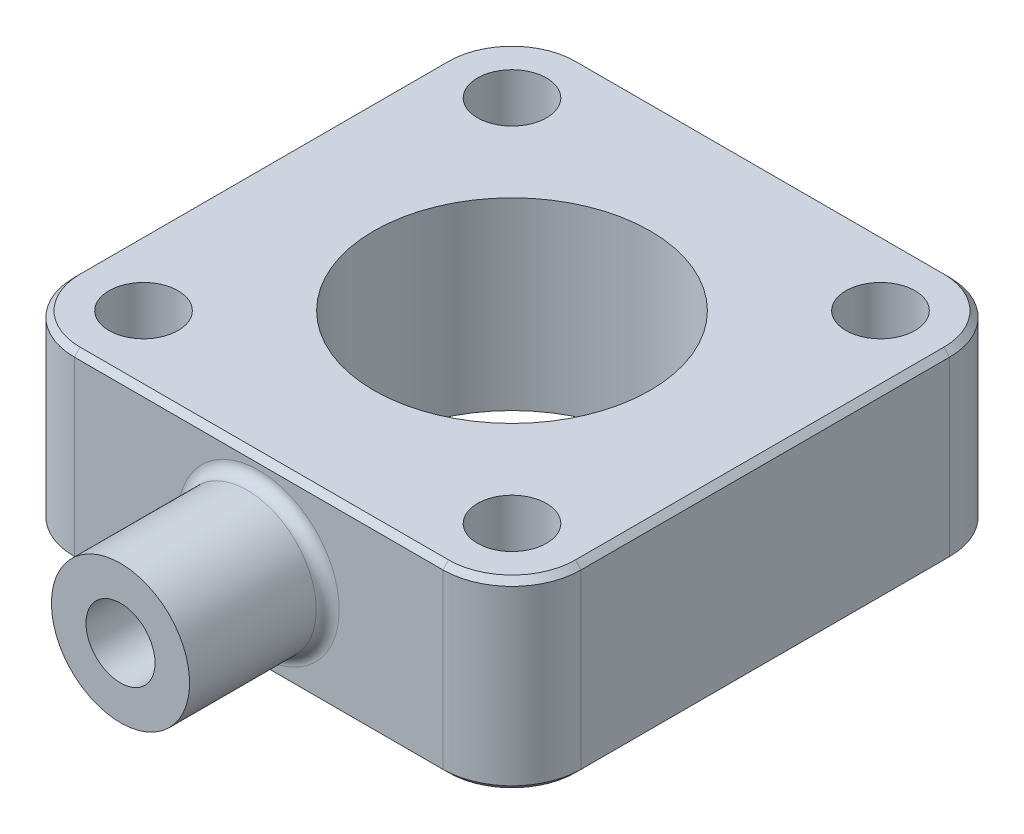
ISO-10303-21;
HEADER;
FILE_DESCRIPTION(('STEP AP214'),'2;1');
FILE_NAME('part.step','',(''),(''),'','','');
FILE_SCHEMA(('AUTOMOTIVE_DESIGN { 1 0 10303 214 1 1 1 1 }'));
ENDSEC;
DATA;
#1=APPLICATION_CONTEXT('core data for automotive mechanical design processes');
#2=APPLICATION_PROTOCOL_DEFINITION('international standard','automotive_design',2000,#1);
#3=PRODUCT_CONTEXT('',#1,'mechanical');
#4=PRODUCT('Part','Part','',(#3));
#5=PRODUCT_RELATED_PRODUCT_CATEGORY('part','',(#4));
#6=PRODUCT_DEFINITION_FORMATION('','',#4);
#7=PRODUCT_DEFINITION_CONTEXT('part definition',#1,'design');
#8=PRODUCT_DEFINITION('design','',#6,#7);
#9=PRODUCT_DEFINITION_SHAPE('','',#8);
#10=(LENGTH_UNIT() NAMED_UNIT(*) SI_UNIT(.MILLI.,.METRE.));
#11=(NAMED_UNIT(*) PLANE_ANGLE_UNIT() SI_UNIT($,.RADIAN.));
#12=(NAMED_UNIT(*) SI_UNIT($,.STERADIAN.) SOLID_ANGLE_UNIT());
#13=UNCERTAINTY_MEASURE_WITH_UNIT(LENGTH_MEASURE(1.E-05),#10,'distance_accuracy_value','');
#14=(GEOMETRIC_REPRESENTATION_CONTEXT(3) GLOBAL_UNCERTAINTY_ASSIGNED_CONTEXT((#13)) GLOBAL_UNIT_ASSIGNED_CONTEXT((#10,
#11,#12)) REPRESENTATION_CONTEXT('',''));
#15=CARTESIAN_POINT('',(0.,0.,0.));
#16=DIRECTION('',(0.,0.,1.));
#17=DIRECTION('',(1.,0.,0.));
#18=AXIS2_PLACEMENT_3D('',#15,#16,#17);
#19=CARTESIAN_POINT('',(8.,4.,8.));
#20=DIRECTION('',(0.,1.,0.));
#21=DIRECTION('',(0.,0.,1.));
#22=AXIS2_PLACEMENT_3D('',#19,#20,#21);
#23=PLANE('',#22);
#24=CARTESIAN_POINT('',(8.,4.,-8.));
#25=DIRECTION('',(0.,1.,0.));
#26=DIRECTION('',(0.,0.,1.));
#27=AXIS2_PLACEMENT_3D('',#24,#25,#26);
#28=CIRCLE('',#27,2.75);
#29=CARTESIAN_POINT('',(10.75,4.,-7.99999999999998));
#30=VERTEX_POINT('',#29);
#31=CARTESIAN_POINT('',(7.99999999999998,4.,-10.75));
#32=VERTEX_POINT('',#31);
#33=EDGE_CURVE('E69',#30,#32,#28,.T.);
#34=ORIENTED_EDGE('',*,*,#33,.T.);
#35=DIRECTION('',(-1.,0.,0.));
#36=VECTOR('',#35,1.);
#37=CARTESIAN_POINT('',(-7.99999999999998,4.,-10.75));
#38=LINE('',#37,#36);
#39=CARTESIAN_POINT('',(-7.99999999999998,4.,-10.75));
#40=VERTEX_POINT('',#39);
#41=EDGE_CURVE('E229',#32,#40,#38,.T.);
#42=ORIENTED_EDGE('',*,*,#41,.T.);
#43=CARTESIAN_POINT('',(-8.,4.,-7.99999999999999));
#44=DIRECTION('',(0.,1.,0.));
#45=DIRECTION('',(0.,0.,1.));
#46=AXIS2_PLACEMENT_3D('',#43,#44,#45);
#47=CIRCLE('',#46,2.75);
#48=CARTESIAN_POINT('',(-10.75,4.,-7.99999999999997));
#49=VERTEX_POINT('',#48);
#50=EDGE_CURVE('E195',#40,#49,#47,.T.);
#51=ORIENTED_EDGE('',*,*,#50,.T.);
#52=DIRECTION('',(0.,0.,1.));
#53=VECTOR('',#52,1.);
#54=CARTESIAN_POINT('',(-10.75,4.,7.99999999999998));
#55=LINE('',#54,#53);
#56=CARTESIAN_POINT('',(-10.75,4.,7.99999999999998));
#57=VERTEX_POINT('',#56);
#58=EDGE_CURVE('E503',#49,#57,#55,.T.);
#59=ORIENTED_EDGE('',*,*,#58,.T.);
#60=CARTESIAN_POINT('',(-8.,4.,8.));
#61=DIRECTION('',(0.,1.,0.));
#62=DIRECTION('',(0.,0.,1.));
#63=AXIS2_PLACEMENT_3D('',#60,#61,#62);
#64=CIRCLE('',#63,2.75);
#65=CARTESIAN_POINT('',(-7.99999999999998,4.,10.75));
#66=VERTEX_POINT('',#65);
#67=EDGE_CURVE('E497',#57,#66,#64,.T.);
#68=ORIENTED_EDGE('',*,*,#67,.T.);
#69=DIRECTION('',(1.,0.,0.));
#70=VECTOR('',#69,1.);
#71=CARTESIAN_POINT('',(7.99999999999998,4.,10.75));
#72=LINE('',#71,#70);
#73=CARTESIAN_POINT('',(7.99999999999998,4.,10.75));
#74=VERTEX_POINT('',#73);
#75=EDGE_CURVE('E462',#66,#74,#72,.T.);
#76=ORIENTED_EDGE('',*,*,#75,.T.);
#77=CARTESIAN_POINT('',(8.,4.,8.));
#78=DIRECTION('',(0.,1.,0.));
#79=DIRECTION('',(0.,0.,1.));
#80=AXIS2_PLACEMENT_3D('',#77,#78,#79);
#81=CIRCLE('',#80,2.75);
#82=CARTESIAN_POINT('',(10.75,4.,7.99999999999997));
#83=VERTEX_POINT('',#82);
#84=EDGE_CURVE('E494',#74,#83,#81,.T.);
#85=ORIENTED_EDGE('',*,*,#84,.T.);
#86=DIRECTION('',(0.,0.,-1.));
#87=VECTOR('',#86,1.);
#88=CARTESIAN_POINT('',(10.75,4.,-7.99999999999998));
#89=LINE('',#88,#87);
#90=EDGE_CURVE('E500',#83,#30,#89,.T.);
#91=ORIENTED_EDGE('',*,*,#90,.T.);
#92=EDGE_LOOP('',(#34,#42,#51,#59,#68,#76,#85,#91));
#93=FACE_BOUND('',#92,.T.);
#94=CARTESIAN_POINT('',(-8.,4.,8.));
#95=DIRECTION('',(0.,1.,0.));
#96=DIRECTION('',(0.,0.,1.));
#97=AXIS2_PLACEMENT_3D('',#94,#95,#96);
#98=CIRCLE('',#97,1.5);
#99=CARTESIAN_POINT('',(-8.,4.,9.5));
#100=VERTEX_POINT('',#99);
#101=EDGE_CURVE('E602',#100,#100,#98,.T.);
#102=ORIENTED_EDGE('',*,*,#101,.F.);
#103=EDGE_LOOP('',(#102));
#104=FACE_BOUND('',#103,.T.);
#105=CARTESIAN_POINT('',(8.,4.,-8.));
#106=DIRECTION('',(0.,1.,0.));
#107=DIRECTION('',(0.,0.,1.));
#108=AXIS2_PLACEMENT_3D('',#105,#106,#107);
#109=CIRCLE('',#108,1.5);
#110=CARTESIAN_POINT('',(8.,4.,-6.5));
#111=VERTEX_POINT('',#110);
#112=EDGE_CURVE('E586',#111,#111,#109,.T.);
#113=ORIENTED_EDGE('',*,*,#112,.F.);
#114=EDGE_LOOP('',(#113));
#115=FACE_BOUND('',#114,.T.);
#116=CARTESIAN_POINT('',(-8.,4.,-7.99999999999999));
#117=DIRECTION('',(0.,1.,0.));
#118=DIRECTION('',(0.,0.,1.));
#119=AXIS2_PLACEMENT_3D('',#116,#117,#118);
#120=CIRCLE('',#119,1.5);
#121=CARTESIAN_POINT('',(-8.,4.,-6.49999999999999));
#122=VERTEX_POINT('',#121);
#123=EDGE_CURVE('E581',#122,#122,#120,.T.);
#124=ORIENTED_EDGE('',*,*,#123,.F.);
#125=EDGE_LOOP('',(#124));
#126=FACE_BOUND('',#125,.T.);
#127=CARTESIAN_POINT('',(8.,4.,8.));
#128=DIRECTION('',(0.,1.,0.));
#129=DIRECTION('',(0.,0.,1.));
#130=AXIS2_PLACEMENT_3D('',#127,#128,#129);
#131=CIRCLE('',#130,1.5);
#132=CARTESIAN_POINT('',(8.,4.,9.5));
#133=VERTEX_POINT('',#132);
#134=EDGE_CURVE('E594',#133,#133,#131,.T.);
#135=ORIENTED_EDGE('',*,*,#134,.F.);
#136=EDGE_LOOP('',(#135));
#137=FACE_BOUND('',#136,.T.);
#138=CARTESIAN_POINT('',(0.,4.,0.));
#139=DIRECTION('',(0.,1.,0.));
#140=DIRECTION('',(0.,0.,1.));
#141=AXIS2_PLACEMENT_3D('',#138,#139,#140);
#142=CIRCLE('',#141,6.);
#143=CARTESIAN_POINT('',(0.,4.,6.));
#144=VERTEX_POINT('',#143);
#145=EDGE_CURVE('E610',#144,#144,#142,.T.);
#146=ORIENTED_EDGE('',*,*,#145,.F.);
#147=EDGE_LOOP('',(#146));
#148=FACE_BOUND('',#147,.T.);
#149=ADVANCED_FACE('F45',(#93,#104,#115,#126,#137,#148),#23,.T.);
#150=CARTESIAN_POINT('',(8.,-4.,8.));
#151=DIRECTION('',(0.,1.,0.));
#152=DIRECTION('',(0.,0.,1.));
#153=AXIS2_PLACEMENT_3D('',#150,#151,#152);
#154=PLANE('',#153);
#155=CARTESIAN_POINT('',(-8.,-4.,-7.99999999999999));
#156=DIRECTION('',(0.,1.,0.));
#157=DIRECTION('',(0.,0.,1.));
#158=AXIS2_PLACEMENT_3D('',#155,#156,#157);
#159=CIRCLE('',#158,2.75);
#160=CARTESIAN_POINT('',(-10.75,-4.,-7.99999999999997));
#161=VERTEX_POINT('',#160);
#162=CARTESIAN_POINT('',(-7.99999999999998,-4.,-10.75));
#163=VERTEX_POINT('',#162);
#164=EDGE_CURVE('E542',#161,#163,#159,.F.);
#165=ORIENTED_EDGE('',*,*,#164,.T.);
#166=DIRECTION('',(1.,0.,0.));
#167=VECTOR('',#166,1.);
#168=CARTESIAN_POINT('',(8.,-4.,-10.75));
#169=LINE('',#168,#167);
#170=CARTESIAN_POINT('',(7.99999999999998,-4.,-10.75));
#171=VERTEX_POINT('',#170);
#172=EDGE_CURVE('E174',#163,#171,#169,.T.);
#173=ORIENTED_EDGE('',*,*,#172,.T.);
#174=CARTESIAN_POINT('',(8.,-4.,-8.));
#175=DIRECTION('',(0.,1.,0.));
#176=DIRECTION('',(0.,0.,1.));
#177=AXIS2_PLACEMENT_3D('',#174,#175,#176);
#178=CIRCLE('',#177,2.75);
#179=CARTESIAN_POINT('',(10.75,-4.,-7.99999999999998));
#180=VERTEX_POINT('',#179);
#181=EDGE_CURVE('E545',#171,#180,#178,.F.);
#182=ORIENTED_EDGE('',*,*,#181,.T.);
#183=DIRECTION('',(0.,0.,1.));
#184=VECTOR('',#183,1.);
#185=CARTESIAN_POINT('',(10.75,-4.,8.));
#186=LINE('',#185,#184);
#187=CARTESIAN_POINT('',(10.75,-4.,7.99999999999997));
#188=VERTEX_POINT('',#187);
#189=EDGE_CURVE('E551',#180,#188,#186,.T.);
#190=ORIENTED_EDGE('',*,*,#189,.T.);
#191=CARTESIAN_POINT('',(8.,-4.,8.));
#192=DIRECTION('',(0.,1.,0.));
#193=DIRECTION('',(0.,0.,1.));
#194=AXIS2_PLACEMENT_3D('',#191,#192,#193);
#195=CIRCLE('',#194,2.75);
#196=CARTESIAN_POINT('',(7.99999999999998,-4.,10.75));
#197=VERTEX_POINT('',#196);
#198=EDGE_CURVE('E557',#188,#197,#195,.F.);
#199=ORIENTED_EDGE('',*,*,#198,.T.);
#200=DIRECTION('',(-1.,0.,0.));
#201=VECTOR('',#200,1.);
#202=CARTESIAN_POINT('',(8.,-4.,10.75));
#203=LINE('',#202,#201);
#204=CARTESIAN_POINT('',(-7.99999999999998,-4.,10.75));
#205=VERTEX_POINT('',#204);
#206=EDGE_CURVE('E560',#197,#205,#203,.T.);
#207=ORIENTED_EDGE('',*,*,#206,.T.);
#208=CARTESIAN_POINT('',(-8.,-4.,8.));
#209=DIRECTION('',(0.,1.,0.));
#210=DIRECTION('',(0.,0.,1.));
#211=AXIS2_PLACEMENT_3D('',#208,#209,#210);
#212=CIRCLE('',#211,2.75);
#213=CARTESIAN_POINT('',(-10.75,-4.,7.99999999999998));
#214=VERTEX_POINT('',#213);
#215=EDGE_CURVE('E554',#205,#214,#212,.F.);
#216=ORIENTED_EDGE('',*,*,#215,.T.);
#217=DIRECTION('',(0.,0.,-1.));
#218=VECTOR('',#217,1.);
#219=CARTESIAN_POINT('',(-10.75,-4.,8.));
#220=LINE('',#219,#218);
#221=EDGE_CURVE('E548',#214,#161,#220,.T.);
#222=ORIENTED_EDGE('',*,*,#221,.T.);
#223=EDGE_LOOP('',(#165,#173,#182,#190,#199,#207,#216,#222));
#224=FACE_BOUND('',#223,.T.);
#225=CARTESIAN_POINT('',(-8.,-4.,-7.99999999999999));
#226=DIRECTION('',(0.,1.,0.));
#227=DIRECTION('',(0.,0.,1.));
#228=AXIS2_PLACEMENT_3D('',#225,#226,#227);
#229=CIRCLE('',#228,1.5);
#230=CARTESIAN_POINT('',(-8.,-4.,-6.49999999999999));
#231=VERTEX_POINT('',#230);
#232=EDGE_CURVE('E582',#231,#231,#229,.T.);
#233=ORIENTED_EDGE('',*,*,#232,.T.);
#234=EDGE_LOOP('',(#233));
#235=FACE_BOUND('',#234,.T.);
#236=CARTESIAN_POINT('',(8.,-4.,-8.));
#237=DIRECTION('',(0.,1.,0.));
#238=DIRECTION('',(0.,0.,1.));
#239=AXIS2_PLACEMENT_3D('',#236,#237,#238);
#240=CIRCLE('',#239,1.5);
#241=CARTESIAN_POINT('',(8.,-4.,-6.5));
#242=VERTEX_POINT('',#241);
#243=EDGE_CURVE('E590',#242,#242,#240,.T.);
#244=ORIENTED_EDGE('',*,*,#243,.T.);
#245=EDGE_LOOP('',(#244));
#246=FACE_BOUND('',#245,.T.);
#247=CARTESIAN_POINT('',(8.,-4.,8.));
#248=DIRECTION('',(0.,1.,0.));
#249=DIRECTION('',(0.,0.,1.));
#250=AXIS2_PLACEMENT_3D('',#247,#248,#249);
#251=CIRCLE('',#250,1.5);
#252=CARTESIAN_POINT('',(8.,-4.,9.5));
#253=VERTEX_POINT('',#252);
#254=EDGE_CURVE('E598',#253,#253,#251,.T.);
#255=ORIENTED_EDGE('',*,*,#254,.T.);
#256=EDGE_LOOP('',(#255));
#257=FACE_BOUND('',#256,.T.);
#258=CARTESIAN_POINT('',(-8.,-4.,8.));
#259=DIRECTION('',(0.,1.,0.));
#260=DIRECTION('',(0.,0.,1.));
#261=AXIS2_PLACEMENT_3D('',#258,#259,#260);
#262=CIRCLE('',#261,1.5);
#263=CARTESIAN_POINT('',(-8.,-4.,9.5));
#264=VERTEX_POINT('',#263);
#265=EDGE_CURVE('E606',#264,#264,#262,.T.);
#266=ORIENTED_EDGE('',*,*,#265,.T.);
#267=EDGE_LOOP('',(#266));
#268=FACE_BOUND('',#267,.T.);
#269=CARTESIAN_POINT('',(0.,-4.,0.));
#270=DIRECTION('',(0.,1.,0.));
#271=DIRECTION('',(0.,0.,1.));
#272=AXIS2_PLACEMENT_3D('',#269,#270,#271);
#273=CIRCLE('',#272,6.);
#274=CARTESIAN_POINT('',(0.,-4.,6.));
#275=VERTEX_POINT('',#274);
#276=EDGE_CURVE('E614',#275,#275,#273,.T.);
#277=ORIENTED_EDGE('',*,*,#276,.T.);
#278=EDGE_LOOP('',(#277));
#279=FACE_BOUND('',#278,.T.);
#280=ADVANCED_FACE('F312',(#224,#235,#246,#257,#268,#279),#154,.F.);
#281=CARTESIAN_POINT('',(8.,4.,8.));
#282=DIRECTION('',(0.,-1.,0.));
#283=DIRECTION('',(0.,0.,-1.));
#284=AXIS2_PLACEMENT_3D('',#281,#282,#283);
#285=CYLINDRICAL_SURFACE('',#284,3.);
#286=DIRECTION('',(0.,-1.,0.));
#287=VECTOR('',#286,1.);
#288=CARTESIAN_POINT('',(7.99999999999998,4.,11.));
#289=LINE('',#288,#287);
#290=CARTESIAN_POINT('',(7.99999999999998,3.75,11.));
#291=VERTEX_POINT('',#290);
#292=CARTESIAN_POINT('',(7.99999999999998,-3.75,11.));
#293=VERTEX_POINT('',#292);
#294=EDGE_CURVE('E578',#291,#293,#289,.T.);
#295=ORIENTED_EDGE('',*,*,#294,.T.);
#296=CARTESIAN_POINT('',(8.,-3.75,8.));
#297=DIRECTION('',(0.,1.,0.));
#298=DIRECTION('',(0.,0.,1.));
#299=AXIS2_PLACEMENT_3D('',#296,#297,#298);
#300=CIRCLE('',#299,3.);
#301=CARTESIAN_POINT('',(11.,-3.75,7.99999999999997));
#302=VERTEX_POINT('',#301);
#303=EDGE_CURVE('E484',#293,#302,#300,.T.);
#304=ORIENTED_EDGE('',*,*,#303,.T.);
#305=DIRECTION('',(0.,-1.,0.));
#306=VECTOR('',#305,1.);
#307=CARTESIAN_POINT('',(11.,4.,7.99999999999997));
#308=LINE('',#307,#306);
#309=CARTESIAN_POINT('',(11.,3.75,7.99999999999997));
#310=VERTEX_POINT('',#309);
#311=EDGE_CURVE('E192',#310,#302,#308,.T.);
#312=ORIENTED_EDGE('',*,*,#311,.F.);
#313=CARTESIAN_POINT('',(8.,3.75,8.));
#314=DIRECTION('',(0.,1.,0.));
#315=DIRECTION('',(0.,0.,1.));
#316=AXIS2_PLACEMENT_3D('',#313,#314,#315);
#317=CIRCLE('',#316,3.);
#318=EDGE_CURVE('E476',#310,#291,#317,.F.);
#319=ORIENTED_EDGE('',*,*,#318,.T.);
#320=EDGE_LOOP('',(#295,#304,#312,#319));
#321=FACE_BOUND('',#320,.T.);
#322=ADVANCED_FACE('F317',(#321),#285,.T.);
#323=CARTESIAN_POINT('',(11.,4.,7.99999999999997));
#324=DIRECTION('',(-1.,0.,0.));
#325=DIRECTION('',(0.,0.,1.));
#326=AXIS2_PLACEMENT_3D('',#323,#324,#325);
#327=PLANE('',#326);
#328=ORIENTED_EDGE('',*,*,#311,.T.);
#329=DIRECTION('',(0.,0.,-1.));
#330=VECTOR('',#329,1.);
#331=CARTESIAN_POINT('',(11.,-3.75,7.99999999999997));
#332=LINE('',#331,#330);
#333=CARTESIAN_POINT('',(11.,-3.75,-7.99999999999998));
#334=VERTEX_POINT('',#333);
#335=EDGE_CURVE('E472',#302,#334,#332,.T.);
#336=ORIENTED_EDGE('',*,*,#335,.T.);
#337=DIRECTION('',(0.,-1.,0.));
#338=VECTOR('',#337,1.);
#339=CARTESIAN_POINT('',(11.,4.,-7.99999999999998));
#340=LINE('',#339,#338);
#341=CARTESIAN_POINT('',(11.,3.75,-7.99999999999998));
#342=VERTEX_POINT('',#341);
#343=EDGE_CURVE('E525',#342,#334,#340,.T.);
#344=ORIENTED_EDGE('',*,*,#343,.F.);
#345=DIRECTION('',(0.,0.,1.));
#346=VECTOR('',#345,1.);
#347=CARTESIAN_POINT('',(11.,3.75,7.99999999999997));
#348=LINE('',#347,#346);
#349=EDGE_CURVE('E478',#342,#310,#348,.T.);
#350=ORIENTED_EDGE('',*,*,#349,.T.);
#351=EDGE_LOOP('',(#328,#336,#344,#350));
#352=FACE_BOUND('',#351,.T.);
#353=ADVANCED_FACE('F343',(#352),#327,.F.);
#354=CARTESIAN_POINT('',(8.,4.,-8.));
#355=DIRECTION('',(0.,-1.,0.));
#356=DIRECTION('',(0.,0.,-1.));
#357=AXIS2_PLACEMENT_3D('',#354,#355,#356);
#358=CYLINDRICAL_SURFACE('',#357,3.);
#359=ORIENTED_EDGE('',*,*,#343,.T.);
#360=CARTESIAN_POINT('',(8.,-3.75,-8.));
#361=DIRECTION('',(0.,1.,0.));
#362=DIRECTION('',(0.,0.,1.));
#363=AXIS2_PLACEMENT_3D('',#360,#361,#362);
#364=CIRCLE('',#363,3.);
#365=CARTESIAN_POINT('',(7.99999999999998,-3.75,-11.));
#366=VERTEX_POINT('',#365);
#367=EDGE_CURVE('E510',#334,#366,#364,.T.);
#368=ORIENTED_EDGE('',*,*,#367,.T.);
#369=DIRECTION('',(0.,-1.,0.));
#370=VECTOR('',#369,1.);
#371=CARTESIAN_POINT('',(7.99999999999998,4.,-11.));
#372=LINE('',#371,#370);
#373=CARTESIAN_POINT('',(7.99999999999998,3.75,-11.));
#374=VERTEX_POINT('',#373);
#375=EDGE_CURVE('E186',#374,#366,#372,.T.);
#376=ORIENTED_EDGE('',*,*,#375,.F.);
#377=CARTESIAN_POINT('',(8.,3.75,-8.));
#378=DIRECTION('',(0.,1.,0.));
#379=DIRECTION('',(0.,0.,1.));
#380=AXIS2_PLACEMENT_3D('',#377,#378,#379);
#381=CIRCLE('',#380,3.);
#382=EDGE_CURVE('E515',#374,#342,#381,.F.);
#383=ORIENTED_EDGE('',*,*,#382,.T.);
#384=EDGE_LOOP('',(#359,#368,#376,#383));
#385=FACE_BOUND('',#384,.T.);
#386=ADVANCED_FACE('F340',(#385),#358,.T.);
#387=CARTESIAN_POINT('',(7.99999999999998,4.,-11.));
#388=DIRECTION('',(0.,0.,1.));
#389=DIRECTION('',(1.,0.,0.));
#390=AXIS2_PLACEMENT_3D('',#387,#388,#389);
#391=PLANE('',#390);
#392=ORIENTED_EDGE('',*,*,#375,.T.);
#393=DIRECTION('',(-1.,0.,0.));
#394=VECTOR('',#393,1.);
#395=CARTESIAN_POINT('',(7.99999999999998,-3.75,-11.));
#396=LINE('',#395,#394);
#397=CARTESIAN_POINT('',(-7.99999999999998,-3.75,-11.));
#398=VERTEX_POINT('',#397);
#399=EDGE_CURVE('E184',#366,#398,#396,.T.);
#400=ORIENTED_EDGE('',*,*,#399,.T.);
#401=DIRECTION('',(0.,-1.,0.));
#402=VECTOR('',#401,1.);
#403=CARTESIAN_POINT('',(-7.99999999999998,4.,-11.));
#404=LINE('',#403,#402);
#405=CARTESIAN_POINT('',(-7.99999999999998,3.75,-11.));
#406=VERTEX_POINT('',#405);
#407=EDGE_CURVE('E166',#406,#398,#404,.T.);
#408=ORIENTED_EDGE('',*,*,#407,.F.);
#409=DIRECTION('',(1.,0.,0.));
#410=VECTOR('',#409,1.);
#411=CARTESIAN_POINT('',(7.99999999999998,3.75,-11.));
#412=LINE('',#411,#410);
#413=EDGE_CURVE('E181',#406,#374,#412,.T.);
#414=ORIENTED_EDGE('',*,*,#413,.T.);
#415=EDGE_LOOP('',(#392,#400,#408,#414));
#416=FACE_BOUND('',#415,.T.);
#417=ADVANCED_FACE('F180',(#416),#391,.F.);
#418=CARTESIAN_POINT('',(-8.,4.,-7.99999999999999));
#419=DIRECTION('',(0.,-1.,0.));
#420=DIRECTION('',(0.,0.,-1.));
#421=AXIS2_PLACEMENT_3D('',#418,#419,#420);
#422=CYLINDRICAL_SURFACE('',#421,3.);
#423=ORIENTED_EDGE('',*,*,#407,.T.);
#424=CARTESIAN_POINT('',(-8.,-3.75,-7.99999999999999));
#425=DIRECTION('',(0.,1.,0.));
#426=DIRECTION('',(0.,0.,1.));
#427=AXIS2_PLACEMENT_3D('',#424,#425,#426);
#428=CIRCLE('',#427,3.);
#429=CARTESIAN_POINT('',(-11.,-3.75,-7.99999999999997));
#430=VERTEX_POINT('',#429);
#431=EDGE_CURVE('E173',#398,#430,#428,.T.);
#432=ORIENTED_EDGE('',*,*,#431,.T.);
#433=DIRECTION('',(0.,-1.,0.));
#434=VECTOR('',#433,1.);
#435=CARTESIAN_POINT('',(-11.,4.,-7.99999999999997));
#436=LINE('',#435,#434);
#437=CARTESIAN_POINT('',(-11.,3.75,-7.99999999999997));
#438=VERTEX_POINT('',#437);
#439=EDGE_CURVE('E168',#438,#430,#436,.T.);
#440=ORIENTED_EDGE('',*,*,#439,.F.);
#441=CARTESIAN_POINT('',(-8.,3.75,-7.99999999999999));
#442=DIRECTION('',(0.,1.,0.));
#443=DIRECTION('',(0.,0.,1.));
#444=AXIS2_PLACEMENT_3D('',#441,#442,#443);
#445=CIRCLE('',#444,3.);
#446=EDGE_CURVE('E163',#438,#406,#445,.F.);
#447=ORIENTED_EDGE('',*,*,#446,.T.);
#448=EDGE_LOOP('',(#423,#432,#440,#447));
#449=FACE_BOUND('',#448,.T.);
#450=ADVANCED_FACE('F165',(#449),#422,.T.);
#451=CARTESIAN_POINT('',(-11.,4.,7.99999999999997));
#452=DIRECTION('',(1.,0.,0.));
#453=DIRECTION('',(0.,0.,-1.));
#454=AXIS2_PLACEMENT_3D('',#451,#452,#453);
#455=PLANE('',#454);
#456=ORIENTED_EDGE('',*,*,#439,.T.);
#457=DIRECTION('',(0.,0.,1.));
#458=VECTOR('',#457,1.);
#459=CARTESIAN_POINT('',(-11.,-3.75,7.99999999999997));
#460=LINE('',#459,#458);
#461=CARTESIAN_POINT('',(-11.,-3.75,7.99999999999998));
#462=VERTEX_POINT('',#461);
#463=EDGE_CURVE('E509',#430,#462,#460,.T.);
#464=ORIENTED_EDGE('',*,*,#463,.T.);
#465=DIRECTION('',(0.,-1.,0.));
#466=VECTOR('',#465,1.);
#467=CARTESIAN_POINT('',(-11.,4.,7.99999999999998));
#468=LINE('',#467,#466);
#469=CARTESIAN_POINT('',(-11.,3.75,7.99999999999998));
#470=VERTEX_POINT('',#469);
#471=EDGE_CURVE('E571',#470,#462,#468,.T.);
#472=ORIENTED_EDGE('',*,*,#471,.F.);
#473=DIRECTION('',(0.,0.,-1.));
#474=VECTOR('',#473,1.);
#475=CARTESIAN_POINT('',(-11.,3.75,-7.99999999999997));
#476=LINE('',#475,#474);
#477=EDGE_CURVE('E507',#470,#438,#476,.T.);
#478=ORIENTED_EDGE('',*,*,#477,.T.);
#479=EDGE_LOOP('',(#456,#464,#472,#478));
#480=FACE_BOUND('',#479,.T.);
#481=ADVANCED_FACE('F331',(#480),#455,.F.);
#482=CARTESIAN_POINT('',(-8.,4.,8.));
#483=DIRECTION('',(0.,-1.,0.));
#484=DIRECTION('',(0.,0.,-1.));
#485=AXIS2_PLACEMENT_3D('',#482,#483,#484);
#486=CYLINDRICAL_SURFACE('',#485,3.);
#487=ORIENTED_EDGE('',*,*,#471,.T.);
#488=CARTESIAN_POINT('',(-8.,-3.75,8.));
#489=DIRECTION('',(0.,1.,0.));
#490=DIRECTION('',(0.,0.,1.));
#491=AXIS2_PLACEMENT_3D('',#488,#489,#490);
#492=CIRCLE('',#491,3.);
#493=CARTESIAN_POINT('',(-7.99999999999998,-3.75,11.));
#494=VERTEX_POINT('',#493);
#495=EDGE_CURVE('E471',#462,#494,#492,.T.);
#496=ORIENTED_EDGE('',*,*,#495,.T.);
#497=DIRECTION('',(0.,-1.,0.));
#498=VECTOR('',#497,1.);
#499=CARTESIAN_POINT('',(-7.99999999999998,4.,11.));
#500=LINE('',#499,#498);
#501=CARTESIAN_POINT('',(-7.99999999999998,3.75,11.));
#502=VERTEX_POINT('',#501);
#503=EDGE_CURVE('E574',#502,#494,#500,.T.);
#504=ORIENTED_EDGE('',*,*,#503,.F.);
#505=CARTESIAN_POINT('',(-8.,3.75,8.));
#506=DIRECTION('',(0.,1.,0.));
#507=DIRECTION('',(0.,0.,1.));
#508=AXIS2_PLACEMENT_3D('',#505,#506,#507);
#509=CIRCLE('',#508,3.);
#510=EDGE_CURVE('E465',#502,#470,#509,.F.);
#511=ORIENTED_EDGE('',*,*,#510,.T.);
#512=EDGE_LOOP('',(#487,#496,#504,#511));
#513=FACE_BOUND('',#512,.T.);
#514=ADVANCED_FACE('F328',(#513),#486,.T.);
#515=CARTESIAN_POINT('',(7.99999999999998,4.,11.));
#516=DIRECTION('',(0.,0.,-1.));
#517=DIRECTION('',(-1.,0.,0.));
#518=AXIS2_PLACEMENT_3D('',#515,#516,#517);
#519=PLANE('',#518);
#520=CARTESIAN_POINT('',(0.,0.,11.));
#521=DIRECTION('',(0.,0.,-1.));
#522=DIRECTION('',(-1.,0.,0.));
#523=AXIS2_PLACEMENT_3D('',#520,#521,#522);
#524=CIRCLE('',#523,3.5);
#525=CARTESIAN_POINT('',(-3.5,0.,11.));
#526=VERTEX_POINT('',#525);
#527=EDGE_CURVE('E54',#526,#526,#524,.T.);
#528=ORIENTED_EDGE('',*,*,#527,.T.);
#529=EDGE_LOOP('',(#528));
#530=FACE_BOUND('',#529,.T.);
#531=ORIENTED_EDGE('',*,*,#503,.T.);
#532=DIRECTION('',(1.,0.,0.));
#533=VECTOR('',#532,1.);
#534=CARTESIAN_POINT('',(7.99999999999998,-3.75,11.));
#535=LINE('',#534,#533);
#536=EDGE_CURVE('E489',#494,#293,#535,.T.);
#537=ORIENTED_EDGE('',*,*,#536,.T.);
#538=ORIENTED_EDGE('',*,*,#294,.F.);
#539=DIRECTION('',(-1.,0.,0.));
#540=VECTOR('',#539,1.);
#541=CARTESIAN_POINT('',(-7.99999999999998,3.75,11.));
#542=LINE('',#541,#540);
#543=EDGE_CURVE('E461',#291,#502,#542,.T.);
#544=ORIENTED_EDGE('',*,*,#543,.T.);
#545=EDGE_LOOP('',(#531,#537,#538,#544));
#546=FACE_BOUND('',#545,.T.);
#547=ADVANCED_FACE('F325',(#530,#546),#519,.F.);
#548=CARTESIAN_POINT('',(-8.,4.,-7.99999999999999));
#549=DIRECTION('',(0.,-1.,0.));
#550=DIRECTION('',(0.,0.,-1.));
#551=AXIS2_PLACEMENT_3D('',#548,#549,#550);
#552=CYLINDRICAL_SURFACE('',#551,1.5);
#553=ORIENTED_EDGE('',*,*,#123,.T.);
#554=EDGE_LOOP('',(#553));
#555=FACE_BOUND('',#554,.T.);
#556=ORIENTED_EDGE('',*,*,#232,.F.);
#557=EDGE_LOOP('',(#556));
#558=FACE_BOUND('',#557,.T.);
#559=ADVANCED_FACE('F322',(#555,#558),#552,.F.);
#560=CARTESIAN_POINT('',(8.,4.,-8.));
#561=DIRECTION('',(0.,-1.,0.));
#562=DIRECTION('',(0.,0.,-1.));
#563=AXIS2_PLACEMENT_3D('',#560,#561,#562);
#564=CYLINDRICAL_SURFACE('',#563,1.5);
#565=ORIENTED_EDGE('',*,*,#112,.T.);
#566=EDGE_LOOP('',(#565));
#567=FACE_BOUND('',#566,.T.);
#568=ORIENTED_EDGE('',*,*,#243,.F.);
#569=EDGE_LOOP('',(#568));
#570=FACE_BOUND('',#569,.T.);
#571=ADVANCED_FACE('F642',(#567,#570),#564,.F.);
#572=CARTESIAN_POINT('',(8.,4.,8.));
#573=DIRECTION('',(0.,-1.,0.));
#574=DIRECTION('',(0.,0.,-1.));
#575=AXIS2_PLACEMENT_3D('',#572,#573,#574);
#576=CYLINDRICAL_SURFACE('',#575,1.5);
#577=ORIENTED_EDGE('',*,*,#134,.T.);
#578=EDGE_LOOP('',(#577));
#579=FACE_BOUND('',#578,.T.);
#580=ORIENTED_EDGE('',*,*,#254,.F.);
#581=EDGE_LOOP('',(#580));
#582=FACE_BOUND('',#581,.T.);
#583=ADVANCED_FACE('F639',(#579,#582),#576,.F.);
#584=CARTESIAN_POINT('',(-8.,4.,8.));
#585=DIRECTION('',(0.,-1.,0.));
#586=DIRECTION('',(0.,0.,-1.));
#587=AXIS2_PLACEMENT_3D('',#584,#585,#586);
#588=CYLINDRICAL_SURFACE('',#587,1.5);
#589=ORIENTED_EDGE('',*,*,#101,.T.);
#590=EDGE_LOOP('',(#589));
#591=FACE_BOUND('',#590,.T.);
#592=ORIENTED_EDGE('',*,*,#265,.F.);
#593=EDGE_LOOP('',(#592));
#594=FACE_BOUND('',#593,.T.);
#595=ADVANCED_FACE('F308',(#591,#594),#588,.F.);
#596=CARTESIAN_POINT('',(0.,4.,0.));
#597=DIRECTION('',(0.,-1.,0.));
#598=DIRECTION('',(0.,0.,-1.));
#599=AXIS2_PLACEMENT_3D('',#596,#597,#598);
#600=CYLINDRICAL_SURFACE('',#599,6.);
#601=CARTESIAN_POINT('',(1.5,0.,5.80947501931113));
#602=CARTESIAN_POINT('',(1.49999764715507,-0.0828304505547657,5.80947660051185));
#603=CARTESIAN_POINT('',(1.49311574729838,-0.165686939206797,5.81126583608348));
#604=CARTESIAN_POINT('',(1.46581387527848,-0.329020546904422,5.81821117195949));
#605=CARTESIAN_POINT('',(1.44538602404532,-0.409496252680996,5.82336923173088));
#606=CARTESIAN_POINT('',(1.39169471977917,-0.565682122912224,5.8364323475758));
#607=CARTESIAN_POINT('',(1.35844783671268,-0.641398293231402,5.84433385614245));
#608=CARTESIAN_POINT('',(1.28011268475685,-0.786186511523952,5.86198915217285));
#609=CARTESIAN_POINT('',(1.23502391313642,-0.855258277248137,5.87174301827101));
#610=CARTESIAN_POINT('',(1.13322505638712,-0.986316987157323,5.89224429813367));
#611=CARTESIAN_POINT('',(1.07630213262243,-1.04813616021003,5.90300758573818));
#612=CARTESIAN_POINT('',(0.952909238460399,-1.16145683661621,5.92417725309178));
#613=CARTESIAN_POINT('',(0.886438376508184,-1.21295737537305,5.93458359939834));
#614=CARTESIAN_POINT('',(0.744687120647373,-1.30486528057877,5.95404249312349));
#615=CARTESIAN_POINT('',(0.669296745717072,-1.34510783289688,5.96307412440355));
#616=CARTESIAN_POINT('',(0.512557910575657,-1.41228578649185,5.9785848715559));
#617=CARTESIAN_POINT('',(0.431210331475164,-1.43922315114931,5.98506436400607));
#618=CARTESIAN_POINT('',(0.266615255252497,-1.47848870074715,5.99462855308908));
#619=CARTESIAN_POINT('',(0.183439631729385,-1.49110178659595,5.99777936306588));
#620=CARTESIAN_POINT('',(0.0160972915576618,-1.50225502756533,6.00056156464379));
#621=CARTESIAN_POINT('',(-0.068069276722841,-1.50079726332576,6.00019347658022));
#622=CARTESIAN_POINT('',(-0.233028370758581,-1.48405508984991,5.99602856972121));
#623=CARTESIAN_POINT('',(-0.3138543234016,-1.46907820496769,5.99230801404524));
#624=CARTESIAN_POINT('',(-0.471807371120529,-1.4262172379709,5.98194501914912));
#625=CARTESIAN_POINT('',(-0.548934269055657,-1.39833246877355,5.97530242439064));
#626=CARTESIAN_POINT('',(-0.69811005525271,-1.33019845758776,5.95972505820537));
#627=CARTESIAN_POINT('',(-0.770106764649757,-1.28983977320295,5.95077011817032));
#628=CARTESIAN_POINT('',(-0.906413433510733,-1.19798659253025,5.93153942285789));
#629=CARTESIAN_POINT('',(-0.970722052628258,-1.14649015886363,5.92126343791494));
#630=CARTESIAN_POINT('',(-1.09166105262743,-1.03217475481057,5.90018228261712));
#631=CARTESIAN_POINT('',(-1.1480365186128,-0.969087064591336,5.88937031715551));
#632=CARTESIAN_POINT('',(-1.24946456394453,-0.834240015875849,5.86869026110024));
#633=CARTESIAN_POINT('',(-1.29451661406902,-0.7624802523054,5.85882221463582));
#634=CARTESIAN_POINT('',(-1.3721821935339,-0.61182597951062,5.84112298098989));
#635=CARTESIAN_POINT('',(-1.40473435045574,-0.532898561812083,5.83330190235432));
#636=CARTESIAN_POINT('',(-1.45602843095451,-0.370448719154129,5.82071184083974));
#637=CARTESIAN_POINT('',(-1.47477330982937,-0.286927281610118,5.81594220486131));
#638=CARTESIAN_POINT('',(-1.49749778319911,-0.120024299086127,5.81013213623484));
#639=CARTESIAN_POINT('',(-1.50185428435178,-0.0366973240022224,5.80899653456189));
#640=CARTESIAN_POINT('',(-1.49671019430933,0.129493161946895,5.81032406088623));
#641=CARTESIAN_POINT('',(-1.48721087870928,0.212356714770745,5.81278685760759));
#642=CARTESIAN_POINT('',(-1.4549552783626,0.373868558972824,5.82094249172736));
#643=CARTESIAN_POINT('',(-1.43241844096905,0.452563635942506,5.82658182140625));
#644=CARTESIAN_POINT('',(-1.37497084900237,0.60505887471101,5.84040430962577));
#645=CARTESIAN_POINT('',(-1.34005862862753,0.678858455433204,5.84858776949168));
#646=CARTESIAN_POINT('',(-1.25806240076193,0.82106476672041,5.86677682255957));
#647=CARTESIAN_POINT('',(-1.21075305230138,0.889337304025861,5.87681501163985));
#648=CARTESIAN_POINT('',(-1.10559043940168,1.01711301768081,5.89750249843029));
#649=CARTESIAN_POINT('',(-1.04773544220816,1.07661474999004,5.90815189637082));
#650=CARTESIAN_POINT('',(-0.921394081477089,1.18668662554257,5.92918441818964));
#651=CARTESIAN_POINT('',(-0.852677928797389,1.23699603752929,5.93955421237101));
#652=CARTESIAN_POINT('',(-0.707554024042013,1.32536152017075,5.9585832996824));
#653=CARTESIAN_POINT('',(-0.631146673436387,1.36341822996492,5.96724268202376));
#654=CARTESIAN_POINT('',(-0.473337302596636,1.42586762071676,5.98182069442988));
#655=CARTESIAN_POINT('',(-0.391976071541822,1.45035857062744,5.98775898013446));
#656=CARTESIAN_POINT('',(-0.226124640478212,1.48527620076505,5.99631176037473));
#657=CARTESIAN_POINT('',(-0.141635047561866,1.49570559524343,5.99892689636045));
#658=CARTESIAN_POINT('',(0.0256252896649892,1.5020513843633,6.00051254113217));
#659=CARTESIAN_POINT('',(0.108380740449049,1.49835256364309,5.99957968320012));
#660=CARTESIAN_POINT('',(0.272051244622109,1.4774282590585,5.99438844686135));
#661=CARTESIAN_POINT('',(0.35296635267133,1.46020317748035,5.99013016735643));
#662=CARTESIAN_POINT('',(0.510256553467224,1.41292167034361,5.97878149280944));
#663=CARTESIAN_POINT('',(0.586653741871528,1.38293482002806,5.97170646753999));
#664=CARTESIAN_POINT('',(0.733375579562202,1.31104413147101,5.95546933370076));
#665=CARTESIAN_POINT('',(0.803699461897577,1.26913879099565,5.94630696206604));
#666=CARTESIAN_POINT('',(0.938102892635849,1.17342714900439,5.92660874521999));
#667=CARTESIAN_POINT('',(1.00199248245088,1.11935978563893,5.91604525418417));
#668=CARTESIAN_POINT('',(1.11992253040688,1.0013657220393,5.89485973579863));
#669=CARTESIAN_POINT('',(1.17396048760228,0.937436525853141,5.88423769428834));
#670=CARTESIAN_POINT('',(1.27164303971884,0.800097878698001,5.86391213790822));
#671=CARTESIAN_POINT('',(1.31507492916982,0.726533814881059,5.85422945594827));
#672=CARTESIAN_POINT('',(1.3888903449235,0.572916765115949,5.83715933325923));
#673=CARTESIAN_POINT('',(1.41928336463958,0.492868550839887,5.82977022370054));
#674=CARTESIAN_POINT('',(1.46163379284816,0.344134482259926,5.81927863109675));
#675=CARTESIAN_POINT('',(1.47598975589307,0.276160253424209,5.8156299450082));
#676=CARTESIAN_POINT('',(1.4951734388599,0.138796696500055,5.81072757878358));
#677=CARTESIAN_POINT('',(1.50000197155828,0.0694074896324076,5.80947369434945));
#678=CARTESIAN_POINT('',(1.5,0.,5.80947501931113));
#679=B_SPLINE_CURVE_WITH_KNOTS('',3,(#601,#602,#603,#604,#605,#606,#607,#608,#609,#610,#611,
#612,#613,#614,#615,#616,#617,#618,#619,#620,#621,#622,#623,#624,#625,#626,#627,#628,#629,#630,
#631,#632,#633,#634,#635,#636,#637,#638,#639,#640,#641,#642,#643,#644,#645,#646,#647,#648,#649,
#650,#651,#652,#653,#654,#655,#656,#657,#658,#659,#660,#661,#662,#663,#664,#665,#666,#667,#668,
#669,#670,#671,#672,#673,#674,#675,#676,#677,#678),.UNSPECIFIED.,.T.,.F.,(4,2,2,2,2,2,2,2,2,2,2,
2,2,2,2,2,2,2,2,2,2,2,2,2,2,2,2,2,2,2,2,2,2,2,2,2,2,2,4),(0.,0.248236465041682,0.4966174448572,
0.744678436299613,0.992749960532871,1.24574372515786,1.4987611288792,1.75530897838752,
2.01181895908255,2.26313250597208,2.51440889199612,2.76010957613368,3.00582334034872,
3.25375724552667,3.50173431281348,3.75642279943147,4.01112318719881,4.26705859205041,
4.52293920077729,4.7720614485703,5.02116076310281,5.26618443005524,5.51123712852851,
5.76109707515494,6.01099811331027,6.26715198579191,6.52329249431732,6.77755243684158,
7.03176329345423,7.27910067676474,7.52643070426189,7.77242925935827,8.01845883442843,
8.27038257949243,8.52237018939306,8.77905886370806,9.03556032819972,9.24358696306398,
9.45159585059713),.UNSPECIFIED.);
#680=CARTESIAN_POINT('',(1.5,0.,5.80947501931113));
#681=VERTEX_POINT('',#680);
#682=EDGE_CURVE('E274',#681,#681,#679,.T.);
#683=ORIENTED_EDGE('',*,*,#682,.F.);
#684=EDGE_LOOP('',(#683));
#685=FACE_BOUND('',#684,.T.);
#686=ORIENTED_EDGE('',*,*,#145,.T.);
#687=EDGE_LOOP('',(#686));
#688=FACE_BOUND('',#687,.T.);
#689=ORIENTED_EDGE('',*,*,#276,.F.);
#690=EDGE_LOOP('',(#689));
#691=FACE_BOUND('',#690,.T.);
#692=ADVANCED_FACE('F289',(#685,#688,#691),#600,.F.);
#693=CARTESIAN_POINT('',(0.,0.,17.));
#694=DIRECTION('',(0.,0.,-1.));
#695=DIRECTION('',(-1.,0.,0.));
#696=AXIS2_PLACEMENT_3D('',#693,#694,#695);
#697=CYLINDRICAL_SURFACE('',#696,3.);
#698=CARTESIAN_POINT('',(0.,0.,11.5));
#699=DIRECTION('',(0.,0.,-1.));
#700=DIRECTION('',(-1.,0.,0.));
#701=AXIS2_PLACEMENT_3D('',#698,#699,#700);
#702=CIRCLE('',#701,3.);
#703=CARTESIAN_POINT('',(-3.,0.,11.5));
#704=VERTEX_POINT('',#703);
#705=EDGE_CURVE('E11',#704,#704,#702,.F.);
#706=ORIENTED_EDGE('',*,*,#705,.T.);
#707=EDGE_LOOP('',(#706));
#708=FACE_BOUND('',#707,.T.);
#709=CARTESIAN_POINT('',(0.,0.,17.));
#710=DIRECTION('',(0.,0.,-1.));
#711=DIRECTION('',(-1.,0.,0.));
#712=AXIS2_PLACEMENT_3D('',#709,#710,#711);
#713=CIRCLE('',#712,3.);
#714=CARTESIAN_POINT('',(-3.,0.,17.));
#715=VERTEX_POINT('',#714);
#716=EDGE_CURVE('E280',#715,#715,#713,.T.);
#717=ORIENTED_EDGE('',*,*,#716,.T.);
#718=EDGE_LOOP('',(#717));
#719=FACE_BOUND('',#718,.T.);
#720=ADVANCED_FACE('F301',(#708,#719),#697,.T.);
#721=CARTESIAN_POINT('',(0.,0.,17.));
#722=DIRECTION('',(0.,0.,-1.));
#723=DIRECTION('',(-1.,0.,0.));
#724=AXIS2_PLACEMENT_3D('',#721,#722,#723);
#725=PLANE('',#724);
#726=CARTESIAN_POINT('',(0.,0.,17.));
#727=DIRECTION('',(0.,0.,1.));
#728=DIRECTION('',(1.,0.,0.));
#729=AXIS2_PLACEMENT_3D('',#726,#727,#728);
#730=CIRCLE('',#729,1.5);
#731=CARTESIAN_POINT('',(1.5,0.,17.));
#732=VERTEX_POINT('',#731);
#733=EDGE_CURVE('E267',#732,#732,#730,.T.);
#734=ORIENTED_EDGE('',*,*,#733,.F.);
#735=EDGE_LOOP('',(#734));
#736=FACE_BOUND('',#735,.T.);
#737=ORIENTED_EDGE('',*,*,#716,.F.);
#738=EDGE_LOOP('',(#737));
#739=FACE_BOUND('',#738,.T.);
#740=ADVANCED_FACE('F298',(#736,#739),#725,.F.);
#741=CARTESIAN_POINT('',(0.,0.,0.999999999999994));
#742=DIRECTION('',(0.,0.,1.));
#743=DIRECTION('',(1.,0.,0.));
#744=AXIS2_PLACEMENT_3D('',#741,#742,#743);
#745=CYLINDRICAL_SURFACE('',#744,1.5);
#746=ORIENTED_EDGE('',*,*,#682,.T.);
#747=EDGE_LOOP('',(#746));
#748=FACE_BOUND('',#747,.T.);
#749=ORIENTED_EDGE('',*,*,#733,.T.);
#750=EDGE_LOOP('',(#749));
#751=FACE_BOUND('',#750,.T.);
#752=ADVANCED_FACE('F293',(#748,#751),#745,.F.);
#753=CARTESIAN_POINT('',(7.99999999999998,-3.75,11.));
#754=DIRECTION('',(0.,0.707106781186552,-0.707106781186543));
#755=DIRECTION('',(1.,0.,0.));
#756=AXIS2_PLACEMENT_3D('',#753,#754,#755);
#757=PLANE('',#756);
#758=DIRECTION('',(0.,0.707106781186543,0.707106781186552));
#759=VECTOR('',#758,1.);
#760=CARTESIAN_POINT('',(-7.99999999999998,-4.,10.75));
#761=LINE('',#760,#759);
#762=EDGE_CURVE('E258',#205,#494,#761,.T.);
#763=ORIENTED_EDGE('',*,*,#762,.F.);
#764=ORIENTED_EDGE('',*,*,#206,.F.);
#765=DIRECTION('',(0.,-0.707106781186543,-0.707106781186552));
#766=VECTOR('',#765,1.);
#767=CARTESIAN_POINT('',(7.99999999999998,-3.75,11.));
#768=LINE('',#767,#766);
#769=EDGE_CURVE('E202',#293,#197,#768,.T.);
#770=ORIENTED_EDGE('',*,*,#769,.F.);
#771=ORIENTED_EDGE('',*,*,#536,.F.);
#772=EDGE_LOOP('',(#763,#764,#770,#771));
#773=FACE_BOUND('',#772,.T.);
#774=ADVANCED_FACE('F297',(#773),#757,.F.);
#775=CARTESIAN_POINT('',(8.,-3.75,8.));
#776=DIRECTION('',(0.,1.,0.));
#777=DIRECTION('',(0.,0.,1.));
#778=AXIS2_PLACEMENT_3D('',#775,#776,#777);
#779=CONICAL_SURFACE('',#778,3.,0.785398163397455);
#780=ORIENTED_EDGE('',*,*,#769,.T.);
#781=ORIENTED_EDGE('',*,*,#198,.F.);
#782=DIRECTION('',(-0.707106781186552,-0.707106781186543,0.));
#783=VECTOR('',#782,1.);
#784=CARTESIAN_POINT('',(11.,-3.75,7.99999999999997));
#785=LINE('',#784,#783);
#786=EDGE_CURVE('E255',#302,#188,#785,.T.);
#787=ORIENTED_EDGE('',*,*,#786,.F.);
#788=ORIENTED_EDGE('',*,*,#303,.F.);
#789=EDGE_LOOP('',(#780,#781,#787,#788));
#790=FACE_BOUND('',#789,.T.);
#791=ADVANCED_FACE('F395',(#790),#779,.T.);
#792=CARTESIAN_POINT('',(-8.,-3.75,8.));
#793=DIRECTION('',(0.,1.,0.));
#794=DIRECTION('',(0.,0.,1.));
#795=AXIS2_PLACEMENT_3D('',#792,#793,#794);
#796=CONICAL_SURFACE('',#795,3.,0.785398163397455);
#797=ORIENTED_EDGE('',*,*,#762,.T.);
#798=ORIENTED_EDGE('',*,*,#495,.F.);
#799=DIRECTION('',(-0.707106781186552,0.707106781186543,0.));
#800=VECTOR('',#799,1.);
#801=CARTESIAN_POINT('',(-10.75,-4.,7.99999999999998));
#802=LINE('',#801,#800);
#803=EDGE_CURVE('E251',#214,#462,#802,.T.);
#804=ORIENTED_EDGE('',*,*,#803,.F.);
#805=ORIENTED_EDGE('',*,*,#215,.F.);
#806=EDGE_LOOP('',(#797,#798,#804,#805));
#807=FACE_BOUND('',#806,.T.);
#808=ADVANCED_FACE('F388',(#807),#796,.T.);
#809=CARTESIAN_POINT('',(11.,-3.75,7.99999999999997));
#810=DIRECTION('',(-0.707106781186543,0.707106781186552,0.));
#811=DIRECTION('',(0.,0.,-1.));
#812=AXIS2_PLACEMENT_3D('',#809,#810,#811);
#813=PLANE('',#812);
#814=ORIENTED_EDGE('',*,*,#786,.T.);
#815=ORIENTED_EDGE('',*,*,#189,.F.);
#816=DIRECTION('',(-0.707106781186552,-0.707106781186543,0.));
#817=VECTOR('',#816,1.);
#818=CARTESIAN_POINT('',(11.,-3.75,-7.99999999999998));
#819=LINE('',#818,#817);
#820=EDGE_CURVE('E247',#334,#180,#819,.T.);
#821=ORIENTED_EDGE('',*,*,#820,.F.);
#822=ORIENTED_EDGE('',*,*,#335,.F.);
#823=EDGE_LOOP('',(#814,#815,#821,#822));
#824=FACE_BOUND('',#823,.T.);
#825=ADVANCED_FACE('F381',(#824),#813,.F.);
#826=CARTESIAN_POINT('',(-11.,-3.75,7.99999999999997));
#827=DIRECTION('',(0.707106781186543,0.707106781186552,0.));
#828=DIRECTION('',(0.,0.,1.));
#829=AXIS2_PLACEMENT_3D('',#826,#827,#828);
#830=PLANE('',#829);
#831=ORIENTED_EDGE('',*,*,#803,.T.);
#832=ORIENTED_EDGE('',*,*,#463,.F.);
#833=DIRECTION('',(-0.707106781186552,0.707106781186543,0.));
#834=VECTOR('',#833,1.);
#835=CARTESIAN_POINT('',(-10.75,-4.,-7.99999999999997));
#836=LINE('',#835,#834);
#837=EDGE_CURVE('E243',#161,#430,#836,.T.);
#838=ORIENTED_EDGE('',*,*,#837,.F.);
#839=ORIENTED_EDGE('',*,*,#221,.F.);
#840=EDGE_LOOP('',(#831,#832,#838,#839));
#841=FACE_BOUND('',#840,.T.);
#842=ADVANCED_FACE('F374',(#841),#830,.F.);
#843=CARTESIAN_POINT('',(8.,-3.75,-8.));
#844=DIRECTION('',(0.,1.,0.));
#845=DIRECTION('',(0.,0.,1.));
#846=AXIS2_PLACEMENT_3D('',#843,#844,#845);
#847=CONICAL_SURFACE('',#846,3.,0.785398163397455);
#848=ORIENTED_EDGE('',*,*,#820,.T.);
#849=ORIENTED_EDGE('',*,*,#181,.F.);
#850=DIRECTION('',(0.,-0.707106781186543,0.707106781186552));
#851=VECTOR('',#850,1.);
#852=CARTESIAN_POINT('',(7.99999999999998,-3.75,-11.));
#853=LINE('',#852,#851);
#854=EDGE_CURVE('E240',#366,#171,#853,.T.);
#855=ORIENTED_EDGE('',*,*,#854,.F.);
#856=ORIENTED_EDGE('',*,*,#367,.F.);
#857=EDGE_LOOP('',(#848,#849,#855,#856));
#858=FACE_BOUND('',#857,.T.);
#859=ADVANCED_FACE('F367',(#858),#847,.T.);
#860=CARTESIAN_POINT('',(-8.,-3.75,-7.99999999999999));
#861=DIRECTION('',(0.,1.,0.));
#862=DIRECTION('',(0.,0.,1.));
#863=AXIS2_PLACEMENT_3D('',#860,#861,#862);
#864=CONICAL_SURFACE('',#863,3.,0.785398163397457);
#865=ORIENTED_EDGE('',*,*,#837,.T.);
#866=ORIENTED_EDGE('',*,*,#431,.F.);
#867=DIRECTION('',(0.,0.70710678118654,-0.707106781186555));
#868=VECTOR('',#867,1.);
#869=CARTESIAN_POINT('',(-7.99999999999998,-4.,-10.75));
#870=LINE('',#869,#868);
#871=EDGE_CURVE('E226',#163,#398,#870,.T.);
#872=ORIENTED_EDGE('',*,*,#871,.F.);
#873=ORIENTED_EDGE('',*,*,#164,.F.);
#874=EDGE_LOOP('',(#865,#866,#872,#873));
#875=FACE_BOUND('',#874,.T.);
#876=ADVANCED_FACE('F360',(#875),#864,.T.);
#877=CARTESIAN_POINT('',(7.99999999999998,-3.75,-11.));
#878=DIRECTION('',(0.,0.707106781186552,0.707106781186543));
#879=DIRECTION('',(-1.,0.,0.));
#880=AXIS2_PLACEMENT_3D('',#877,#878,#879);
#881=PLANE('',#880);
#882=ORIENTED_EDGE('',*,*,#854,.T.);
#883=ORIENTED_EDGE('',*,*,#172,.F.);
#884=ORIENTED_EDGE('',*,*,#871,.T.);
#885=ORIENTED_EDGE('',*,*,#399,.F.);
#886=EDGE_LOOP('',(#882,#883,#884,#885));
#887=FACE_BOUND('',#886,.T.);
#888=ADVANCED_FACE('F352',(#887),#881,.F.);
#889=CARTESIAN_POINT('',(8.,4.,10.75));
#890=DIRECTION('',(0.,0.707106781186542,0.707106781186552));
#891=DIRECTION('',(-1.,0.,0.));
#892=AXIS2_PLACEMENT_3D('',#889,#890,#891);
#893=PLANE('',#892);
#894=DIRECTION('',(0.,0.707106781186552,-0.707106781186542));
#895=VECTOR('',#894,1.);
#896=CARTESIAN_POINT('',(-7.99999999999998,3.75,11.));
#897=LINE('',#896,#895);
#898=EDGE_CURVE('E219',#502,#66,#897,.T.);
#899=ORIENTED_EDGE('',*,*,#898,.F.);
#900=ORIENTED_EDGE('',*,*,#543,.F.);
#901=DIRECTION('',(0.,-0.707106781186552,0.707106781186542));
#902=VECTOR('',#901,1.);
#903=CARTESIAN_POINT('',(7.99999999999998,4.,10.75));
#904=LINE('',#903,#902);
#905=EDGE_CURVE('E223',#74,#291,#904,.T.);
#906=ORIENTED_EDGE('',*,*,#905,.F.);
#907=ORIENTED_EDGE('',*,*,#75,.F.);
#908=EDGE_LOOP('',(#899,#900,#906,#907));
#909=FACE_BOUND('',#908,.T.);
#910=ADVANCED_FACE('F359',(#909),#893,.T.);
#911=CARTESIAN_POINT('',(8.,4.,8.));
#912=DIRECTION('',(0.,-1.,0.));
#913=DIRECTION('',(0.,0.,-1.));
#914=AXIS2_PLACEMENT_3D('',#911,#912,#913);
#915=CONICAL_SURFACE('',#914,2.75,0.785398163397441);
#916=ORIENTED_EDGE('',*,*,#905,.T.);
#917=ORIENTED_EDGE('',*,*,#318,.F.);
#918=DIRECTION('',(0.707106781186542,-0.707106781186552,0.));
#919=VECTOR('',#918,1.);
#920=CARTESIAN_POINT('',(10.75,4.,7.99999999999997));
#921=LINE('',#920,#919);
#922=EDGE_CURVE('E215',#83,#310,#921,.T.);
#923=ORIENTED_EDGE('',*,*,#922,.F.);
#924=ORIENTED_EDGE('',*,*,#84,.F.);
#925=EDGE_LOOP('',(#916,#917,#923,#924));
#926=FACE_BOUND('',#925,.T.);
#927=ADVANCED_FACE('F444',(#926),#915,.T.);
#928=CARTESIAN_POINT('',(-8.,4.,8.));
#929=DIRECTION('',(0.,-1.,0.));
#930=DIRECTION('',(0.,0.,-1.));
#931=AXIS2_PLACEMENT_3D('',#928,#929,#930);
#932=CONICAL_SURFACE('',#931,2.75,0.785398163397441);
#933=ORIENTED_EDGE('',*,*,#898,.T.);
#934=ORIENTED_EDGE('',*,*,#67,.F.);
#935=DIRECTION('',(0.707106781186542,0.707106781186552,0.));
#936=VECTOR('',#935,1.);
#937=CARTESIAN_POINT('',(-11.,3.75,7.99999999999998));
#938=LINE('',#937,#936);
#939=EDGE_CURVE('E211',#470,#57,#938,.T.);
#940=ORIENTED_EDGE('',*,*,#939,.F.);
#941=ORIENTED_EDGE('',*,*,#510,.F.);
#942=EDGE_LOOP('',(#933,#934,#940,#941));
#943=FACE_BOUND('',#942,.T.);
#944=ADVANCED_FACE('F437',(#943),#932,.T.);
#945=CARTESIAN_POINT('',(10.75,4.,8.));
#946=DIRECTION('',(0.707106781186552,0.707106781186542,0.));
#947=DIRECTION('',(0.,0.,1.));
#948=AXIS2_PLACEMENT_3D('',#945,#946,#947);
#949=PLANE('',#948);
#950=ORIENTED_EDGE('',*,*,#922,.T.);
#951=ORIENTED_EDGE('',*,*,#349,.F.);
#952=DIRECTION('',(0.707106781186542,-0.707106781186552,0.));
#953=VECTOR('',#952,1.);
#954=CARTESIAN_POINT('',(10.75,4.,-7.99999999999998));
#955=LINE('',#954,#953);
#956=EDGE_CURVE('E207',#30,#342,#955,.T.);
#957=ORIENTED_EDGE('',*,*,#956,.F.);
#958=ORIENTED_EDGE('',*,*,#90,.F.);
#959=EDGE_LOOP('',(#950,#951,#957,#958));
#960=FACE_BOUND('',#959,.T.);
#961=ADVANCED_FACE('F430',(#960),#949,.T.);
#962=CARTESIAN_POINT('',(-10.75,4.,8.));
#963=DIRECTION('',(-0.707106781186552,0.707106781186542,0.));
#964=DIRECTION('',(0.,0.,-1.));
#965=AXIS2_PLACEMENT_3D('',#962,#963,#964);
#966=PLANE('',#965);
#967=ORIENTED_EDGE('',*,*,#939,.T.);
#968=ORIENTED_EDGE('',*,*,#58,.F.);
#969=DIRECTION('',(0.707106781186542,0.707106781186552,0.));
#970=VECTOR('',#969,1.);
#971=CARTESIAN_POINT('',(-11.,3.75,-7.99999999999997));
#972=LINE('',#971,#970);
#973=EDGE_CURVE('E199',#438,#49,#972,.T.);
#974=ORIENTED_EDGE('',*,*,#973,.F.);
#975=ORIENTED_EDGE('',*,*,#477,.F.);
#976=EDGE_LOOP('',(#967,#968,#974,#975));
#977=FACE_BOUND('',#976,.T.);
#978=ADVANCED_FACE('F423',(#977),#966,.T.);
#979=CARTESIAN_POINT('',(8.,4.,-8.));
#980=DIRECTION('',(0.,-1.,0.));
#981=DIRECTION('',(0.,0.,-1.));
#982=AXIS2_PLACEMENT_3D('',#979,#980,#981);
#983=CONICAL_SURFACE('',#982,2.75,0.785398163397441);
#984=ORIENTED_EDGE('',*,*,#956,.T.);
#985=ORIENTED_EDGE('',*,*,#382,.F.);
#986=DIRECTION('',(0.,-0.707106781186552,-0.707106781186542));
#987=VECTOR('',#986,1.);
#988=CARTESIAN_POINT('',(7.99999999999998,4.,-10.75));
#989=LINE('',#988,#987);
#990=EDGE_CURVE('E189',#32,#374,#989,.T.);
#991=ORIENTED_EDGE('',*,*,#990,.F.);
#992=ORIENTED_EDGE('',*,*,#33,.F.);
#993=EDGE_LOOP('',(#984,#985,#991,#992));
#994=FACE_BOUND('',#993,.T.);
#995=ADVANCED_FACE('F417',(#994),#983,.T.);
#996=CARTESIAN_POINT('',(-8.,4.,-7.99999999999999));
#997=DIRECTION('',(0.,-1.,0.));
#998=DIRECTION('',(0.,0.,-1.));
#999=AXIS2_PLACEMENT_3D('',#996,#997,#998);
#1000=CONICAL_SURFACE('',#999,2.75,0.785398163397443);
#1001=ORIENTED_EDGE('',*,*,#973,.T.);
#1002=ORIENTED_EDGE('',*,*,#50,.F.);
#1003=DIRECTION('',(0.,0.70710678118655,0.707106781186545));
#1004=VECTOR('',#1003,1.);
#1005=CARTESIAN_POINT('',(-7.99999999999998,3.75,-11.));
#1006=LINE('',#1005,#1004);
#1007=EDGE_CURVE('E61',#406,#40,#1006,.T.);
#1008=ORIENTED_EDGE('',*,*,#1007,.F.);
#1009=ORIENTED_EDGE('',*,*,#446,.F.);
#1010=EDGE_LOOP('',(#1001,#1002,#1008,#1009));
#1011=FACE_BOUND('',#1010,.T.);
#1012=ADVANCED_FACE('F194',(#1011),#1000,.T.);
#1013=CARTESIAN_POINT('',(8.,4.,-10.75));
#1014=DIRECTION('',(0.,0.707106781186542,-0.707106781186552));
#1015=DIRECTION('',(1.,0.,0.));
#1016=AXIS2_PLACEMENT_3D('',#1013,#1014,#1015);
#1017=PLANE('',#1016);
#1018=ORIENTED_EDGE('',*,*,#990,.T.);
#1019=ORIENTED_EDGE('',*,*,#413,.F.);
#1020=ORIENTED_EDGE('',*,*,#1007,.T.);
#1021=ORIENTED_EDGE('',*,*,#41,.F.);
#1022=EDGE_LOOP('',(#1018,#1019,#1020,#1021));
#1023=FACE_BOUND('',#1022,.T.);
#1024=ADVANCED_FACE('F188',(#1023),#1017,.T.);
#1025=CARTESIAN_POINT('',(0.,0.,11.5));
#1026=DIRECTION('',(0.,0.,-1.));
#1027=DIRECTION('',(-1.,0.,0.));
#1028=AXIS2_PLACEMENT_3D('',#1025,#1026,#1027);
#1029=TOROIDAL_SURFACE('',#1028,3.5,0.5);
#1030=ORIENTED_EDGE('',*,*,#705,.F.);
#1031=EDGE_LOOP('',(#1030));
#1032=FACE_BOUND('',#1031,.T.);
#1033=ORIENTED_EDGE('',*,*,#527,.F.);
#1034=EDGE_LOOP('',(#1033));
#1035=FACE_BOUND('',#1034,.T.);
#1036=ADVANCED_FACE('F47',(#1032,#1035),#1029,.F.);
#1037=CLOSED_SHELL('',(#149,#280,#322,#353,#386,#417,#450,#481,#514,#547,#559,#571,#583,#595,
#692,#720,#740,#752,#774,#791,#808,#825,#842,#859,#876,#888,#910,#927,#944,#961,#978,#995,#1012,
#1024,#1036));
#1038=MANIFOLD_SOLID_BREP('B2',#1037);
#1039=ADVANCED_BREP_SHAPE_REPRESENTATION('',(#18,#1038),#14);
#1040=SHAPE_DEFINITION_REPRESENTATION(#9,#1039);
ENDSEC;
END-ISO-10303-21;
